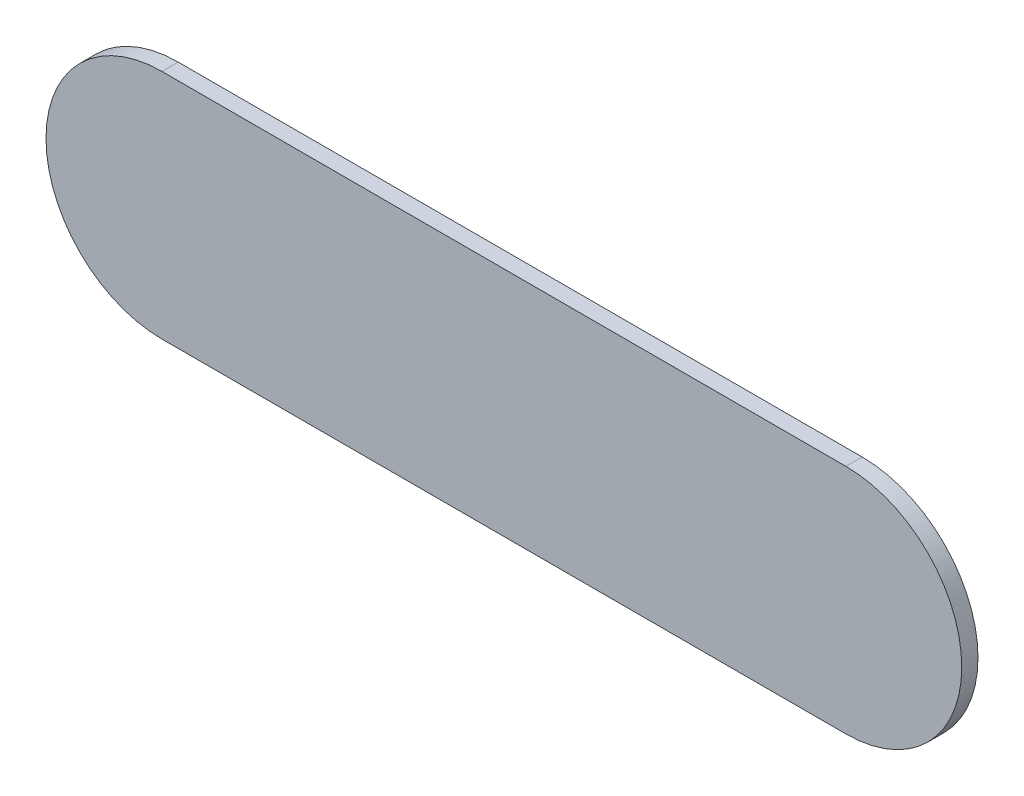
ISO-10303-21;
HEADER;
FILE_DESCRIPTION(('STEP AP214'),'2;1');
FILE_NAME('part.step','',(''),(''),'','','');
FILE_SCHEMA(('AUTOMOTIVE_DESIGN { 1 0 10303 214 1 1 1 1 }'));
ENDSEC;
DATA;
#1=APPLICATION_CONTEXT('core data for automotive mechanical design processes');
#2=APPLICATION_PROTOCOL_DEFINITION('international standard','automotive_design',2000,#1);
#3=PRODUCT_CONTEXT('',#1,'mechanical');
#4=PRODUCT('Part','Part','',(#3));
#5=PRODUCT_RELATED_PRODUCT_CATEGORY('part','',(#4));
#6=PRODUCT_DEFINITION_FORMATION('','',#4);
#7=PRODUCT_DEFINITION_CONTEXT('part definition',#1,'design');
#8=PRODUCT_DEFINITION('design','',#6,#7);
#9=PRODUCT_DEFINITION_SHAPE('','',#8);
#10=(LENGTH_UNIT() NAMED_UNIT(*) SI_UNIT(.MILLI.,.METRE.));
#11=(NAMED_UNIT(*) PLANE_ANGLE_UNIT() SI_UNIT($,.RADIAN.));
#12=(NAMED_UNIT(*) SI_UNIT($,.STERADIAN.) SOLID_ANGLE_UNIT());
#13=UNCERTAINTY_MEASURE_WITH_UNIT(LENGTH_MEASURE(1.E-05),#10,'distance_accuracy_value','');
#14=(GEOMETRIC_REPRESENTATION_CONTEXT(3) GLOBAL_UNCERTAINTY_ASSIGNED_CONTEXT((#13)) GLOBAL_UNIT_ASSIGNED_CONTEXT((#10,
#11,#12)) REPRESENTATION_CONTEXT('',''));
#15=CARTESIAN_POINT('',(0.,0.,0.));
#16=DIRECTION('',(0.,0.,1.));
#17=DIRECTION('',(1.,0.,0.));
#18=AXIS2_PLACEMENT_3D('',#15,#16,#17);
#19=CARTESIAN_POINT('',(104.265499,-60.86,1.635));
#20=DIRECTION('',(0.,0.,1.));
#21=DIRECTION('',(1.,0.,0.));
#22=AXIS2_PLACEMENT_3D('',#19,#20,#21);
#23=PLANE('',#22);
#24=DIRECTION('',(-1.,0.,0.));
#25=VECTOR('',#24,1.);
#26=CARTESIAN_POINT('',(104.265499,-60.86,1.635));
#27=LINE('',#26,#25);
#28=CARTESIAN_POINT('',(104.265499,-60.86,1.635));
#29=VERTEX_POINT('',#28);
#30=CARTESIAN_POINT('',(102.79,-60.86,1.635));
#31=VERTEX_POINT('',#30);
#32=EDGE_CURVE('E81',#29,#31,#27,.T.);
#33=ORIENTED_EDGE('',*,*,#32,.T.);
#34=CARTESIAN_POINT('',(102.79,-61.11,1.635));
#35=DIRECTION('',(0.,0.,1.));
#36=DIRECTION('',(0.,1.,0.));
#37=AXIS2_PLACEMENT_3D('',#34,#35,#36);
#38=CIRCLE('',#37,0.25);
#39=CARTESIAN_POINT('',(102.79,-61.36,1.635));
#40=VERTEX_POINT('',#39);
#41=EDGE_CURVE('E105',#31,#40,#38,.T.);
#42=ORIENTED_EDGE('',*,*,#41,.T.);
#43=DIRECTION('',(1.,0.,0.));
#44=VECTOR('',#43,1.);
#45=CARTESIAN_POINT('',(102.79,-61.36,1.635));
#46=LINE('',#45,#44);
#47=CARTESIAN_POINT('',(104.265499,-61.36,1.635));
#48=VERTEX_POINT('',#47);
#49=EDGE_CURVE('E74',#40,#48,#46,.T.);
#50=ORIENTED_EDGE('',*,*,#49,.T.);
#51=CARTESIAN_POINT('',(104.265499,-61.11,1.635));
#52=DIRECTION('',(0.,0.,1.));
#53=DIRECTION('',(0.,-1.,0.));
#54=AXIS2_PLACEMENT_3D('',#51,#52,#53);
#55=CIRCLE('',#54,0.25);
#56=EDGE_CURVE('E11',#48,#29,#55,.T.);
#57=ORIENTED_EDGE('',*,*,#56,.T.);
#58=EDGE_LOOP('',(#33,#42,#50,#57));
#59=FACE_BOUND('',#58,.T.);
#60=ADVANCED_FACE('F17',(#59),#23,.T.);
#61=CARTESIAN_POINT('',(104.265499,-60.86,1.6));
#62=DIRECTION('',(0.,0.,1.));
#63=DIRECTION('',(1.,0.,0.));
#64=AXIS2_PLACEMENT_3D('',#61,#62,#63);
#65=PLANE('',#64);
#66=CARTESIAN_POINT('',(104.265499,-61.11,1.6));
#67=DIRECTION('',(0.,0.,1.));
#68=DIRECTION('',(0.,-1.,0.));
#69=AXIS2_PLACEMENT_3D('',#66,#67,#68);
#70=CIRCLE('',#69,0.25);
#71=CARTESIAN_POINT('',(104.265499,-61.36,1.6));
#72=VERTEX_POINT('',#71);
#73=CARTESIAN_POINT('',(104.265499,-60.86,1.6));
#74=VERTEX_POINT('',#73);
#75=EDGE_CURVE('E25',#72,#74,#70,.T.);
#76=ORIENTED_EDGE('',*,*,#75,.F.);
#77=DIRECTION('',(1.,0.,0.));
#78=VECTOR('',#77,1.);
#79=CARTESIAN_POINT('',(102.79,-61.36,1.6));
#80=LINE('',#79,#78);
#81=CARTESIAN_POINT('',(102.79,-61.36,1.6));
#82=VERTEX_POINT('',#81);
#83=EDGE_CURVE('E102',#82,#72,#80,.T.);
#84=ORIENTED_EDGE('',*,*,#83,.F.);
#85=CARTESIAN_POINT('',(102.79,-61.11,1.6));
#86=DIRECTION('',(0.,0.,1.));
#87=DIRECTION('',(0.,1.,0.));
#88=AXIS2_PLACEMENT_3D('',#85,#86,#87);
#89=CIRCLE('',#88,0.25);
#90=CARTESIAN_POINT('',(102.79,-60.86,1.6));
#91=VERTEX_POINT('',#90);
#92=EDGE_CURVE('E83',#91,#82,#89,.T.);
#93=ORIENTED_EDGE('',*,*,#92,.F.);
#94=DIRECTION('',(-1.,0.,0.));
#95=VECTOR('',#94,1.);
#96=CARTESIAN_POINT('',(104.265499,-60.86,1.6));
#97=LINE('',#96,#95);
#98=EDGE_CURVE('E79',#74,#91,#97,.T.);
#99=ORIENTED_EDGE('',*,*,#98,.F.);
#100=EDGE_LOOP('',(#76,#84,#93,#99));
#101=FACE_BOUND('',#100,.T.);
#102=ADVANCED_FACE('F85',(#101),#65,.F.);
#103=CARTESIAN_POINT('',(104.265499,-61.11,1.6));
#104=DIRECTION('',(0.,0.,-1.));
#105=DIRECTION('',(0.,-1.,0.));
#106=AXIS2_PLACEMENT_3D('',#103,#104,#105);
#107=CYLINDRICAL_SURFACE('',#106,0.25);
#108=ORIENTED_EDGE('',*,*,#75,.T.);
#109=DIRECTION('',(0.,0.,1.));
#110=VECTOR('',#109,1.);
#111=CARTESIAN_POINT('',(104.265499,-60.86,1.6));
#112=LINE('',#111,#110);
#113=EDGE_CURVE('E68',#74,#29,#112,.T.);
#114=ORIENTED_EDGE('',*,*,#113,.T.);
#115=ORIENTED_EDGE('',*,*,#56,.F.);
#116=DIRECTION('',(0.,0.,1.));
#117=VECTOR('',#116,1.);
#118=CARTESIAN_POINT('',(104.265499,-61.36,1.6));
#119=LINE('',#118,#117);
#120=EDGE_CURVE('E71',#72,#48,#119,.T.);
#121=ORIENTED_EDGE('',*,*,#120,.F.);
#122=EDGE_LOOP('',(#108,#114,#115,#121));
#123=FACE_BOUND('',#122,.T.);
#124=ADVANCED_FACE('F67',(#123),#107,.T.);
#125=CARTESIAN_POINT('',(102.79,-61.36,1.6));
#126=DIRECTION('',(0.,1.,0.));
#127=DIRECTION('',(1.,0.,0.));
#128=AXIS2_PLACEMENT_3D('',#125,#126,#127);
#129=PLANE('',#128);
#130=ORIENTED_EDGE('',*,*,#83,.T.);
#131=ORIENTED_EDGE('',*,*,#120,.T.);
#132=ORIENTED_EDGE('',*,*,#49,.F.);
#133=DIRECTION('',(0.,0.,1.));
#134=VECTOR('',#133,1.);
#135=CARTESIAN_POINT('',(102.79,-61.36,1.6));
#136=LINE('',#135,#134);
#137=EDGE_CURVE('E106',#82,#40,#136,.T.);
#138=ORIENTED_EDGE('',*,*,#137,.F.);
#139=EDGE_LOOP('',(#130,#131,#132,#138));
#140=FACE_BOUND('',#139,.T.);
#141=ADVANCED_FACE('F117',(#140),#129,.F.);
#142=CARTESIAN_POINT('',(102.79,-61.11,1.6));
#143=DIRECTION('',(0.,0.,-1.));
#144=DIRECTION('',(0.,1.,0.));
#145=AXIS2_PLACEMENT_3D('',#142,#143,#144);
#146=CYLINDRICAL_SURFACE('',#145,0.25);
#147=ORIENTED_EDGE('',*,*,#92,.T.);
#148=ORIENTED_EDGE('',*,*,#137,.T.);
#149=ORIENTED_EDGE('',*,*,#41,.F.);
#150=DIRECTION('',(0.,0.,1.));
#151=VECTOR('',#150,1.);
#152=CARTESIAN_POINT('',(102.79,-60.86,1.6));
#153=LINE('',#152,#151);
#154=EDGE_CURVE('E89',#91,#31,#153,.T.);
#155=ORIENTED_EDGE('',*,*,#154,.F.);
#156=EDGE_LOOP('',(#147,#148,#149,#155));
#157=FACE_BOUND('',#156,.T.);
#158=ADVANCED_FACE('F120',(#157),#146,.T.);
#159=CARTESIAN_POINT('',(104.265499,-60.86,1.6));
#160=DIRECTION('',(0.,-1.,0.));
#161=DIRECTION('',(0.,0.,-1.));
#162=AXIS2_PLACEMENT_3D('',#159,#160,#161);
#163=PLANE('',#162);
#164=ORIENTED_EDGE('',*,*,#98,.T.);
#165=ORIENTED_EDGE('',*,*,#154,.T.);
#166=ORIENTED_EDGE('',*,*,#32,.F.);
#167=ORIENTED_EDGE('',*,*,#113,.F.);
#168=EDGE_LOOP('',(#164,#165,#166,#167));
#169=FACE_BOUND('',#168,.T.);
#170=ADVANCED_FACE('F77',(#169),#163,.F.);
#171=CLOSED_SHELL('',(#60,#102,#124,#141,#158,#170));
#172=MANIFOLD_SOLID_BREP('B1',#171);
#173=ADVANCED_BREP_SHAPE_REPRESENTATION('',(#18,#172),#14);
#174=SHAPE_DEFINITION_REPRESENTATION(#9,#173);
ENDSEC;
END-ISO-10303-21;
